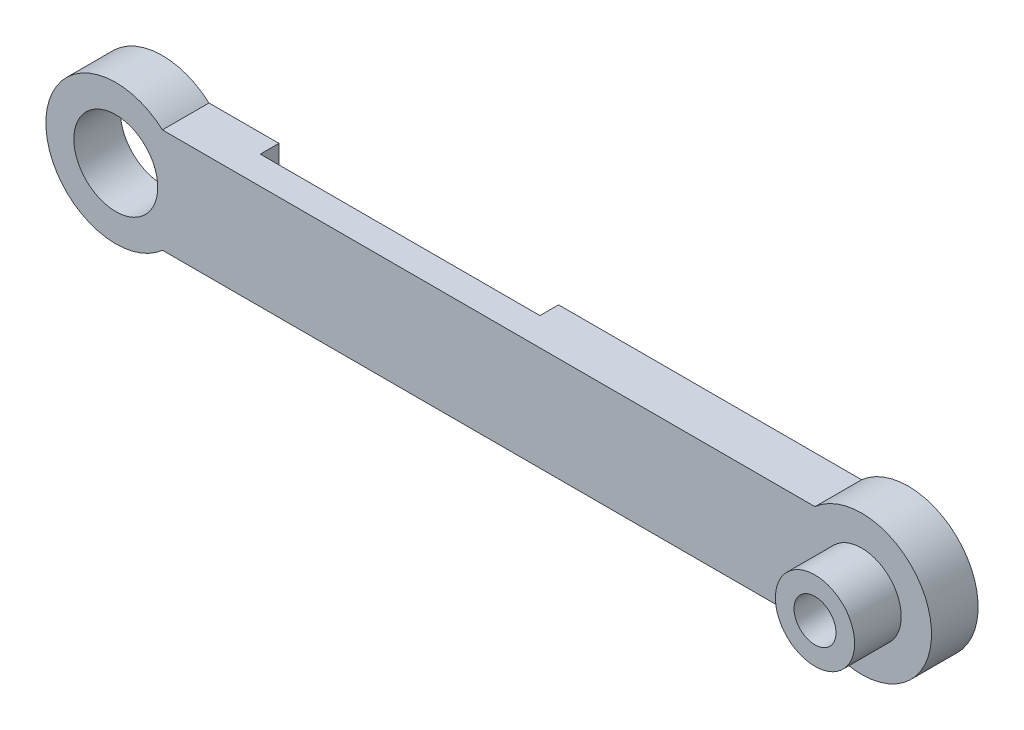
ISO-10303-21;
HEADER;
FILE_DESCRIPTION(('STEP AP214'),'2;1');
FILE_NAME('part.step','',(''),(''),'','','');
FILE_SCHEMA(('AUTOMOTIVE_DESIGN { 1 0 10303 214 1 1 1 1 }'));
ENDSEC;
DATA;
#1=APPLICATION_CONTEXT('core data for automotive mechanical design processes');
#2=APPLICATION_PROTOCOL_DEFINITION('international standard','automotive_design',2000,#1);
#3=PRODUCT_CONTEXT('',#1,'mechanical');
#4=PRODUCT('Part','Part','',(#3));
#5=PRODUCT_RELATED_PRODUCT_CATEGORY('part','',(#4));
#6=PRODUCT_DEFINITION_FORMATION('','',#4);
#7=PRODUCT_DEFINITION_CONTEXT('part definition',#1,'design');
#8=PRODUCT_DEFINITION('design','',#6,#7);
#9=PRODUCT_DEFINITION_SHAPE('','',#8);
#10=(LENGTH_UNIT() NAMED_UNIT(*) SI_UNIT(.MILLI.,.METRE.));
#11=(NAMED_UNIT(*) PLANE_ANGLE_UNIT() SI_UNIT($,.RADIAN.));
#12=(NAMED_UNIT(*) SI_UNIT($,.STERADIAN.) SOLID_ANGLE_UNIT());
#13=UNCERTAINTY_MEASURE_WITH_UNIT(LENGTH_MEASURE(1.E-05),#10,'distance_accuracy_value','');
#14=(GEOMETRIC_REPRESENTATION_CONTEXT(3) GLOBAL_UNCERTAINTY_ASSIGNED_CONTEXT((#13)) GLOBAL_UNIT_ASSIGNED_CONTEXT((#10,
#11,#12)) REPRESENTATION_CONTEXT('',''));
#15=CARTESIAN_POINT('',(0.,0.,0.));
#16=DIRECTION('',(0.,0.,1.));
#17=DIRECTION('',(1.,0.,0.));
#18=AXIS2_PLACEMENT_3D('',#15,#16,#17);
#19=CARTESIAN_POINT('',(0.,0.,0.));
#20=DIRECTION('',(0.,0.,1.));
#21=DIRECTION('',(1.,0.,0.));
#22=AXIS2_PLACEMENT_3D('',#19,#20,#21);
#23=PLANE('',#22);
#24=CARTESIAN_POINT('',(0.,0.,0.));
#25=DIRECTION('',(0.,0.,1.));
#26=DIRECTION('',(1.,0.,0.));
#27=AXIS2_PLACEMENT_3D('',#24,#25,#26);
#28=CIRCLE('',#27,4.5);
#29=CARTESIAN_POINT('',(4.5,0.,0.));
#30=VERTEX_POINT('',#29);
#31=EDGE_CURVE('E148',#30,#30,#28,.T.);
#32=ORIENTED_EDGE('',*,*,#31,.T.);
#33=EDGE_LOOP('',(#32));
#34=FACE_BOUND('',#33,.T.);
#35=DIRECTION('',(-1.,0.,0.));
#36=VECTOR('',#35,1.);
#37=CARTESIAN_POINT('',(4.99999999999999,5.59016994374956,0.));
#38=LINE('',#37,#36);
#39=CARTESIAN_POINT('',(12.4999999999999,5.59016994374956,0.));
#40=VERTEX_POINT('',#39);
#41=CARTESIAN_POINT('',(4.99999999999999,5.59016994374956,0.));
#42=VERTEX_POINT('',#41);
#43=EDGE_CURVE('E77',#40,#42,#38,.T.);
#44=ORIENTED_EDGE('',*,*,#43,.F.);
#45=DIRECTION('',(0.,1.,0.));
#46=VECTOR('',#45,1.);
#47=CARTESIAN_POINT('',(12.4999999999999,-7.50100000000007,0.));
#48=LINE('',#47,#46);
#49=CARTESIAN_POINT('',(12.4999999999999,-5.59016994374956,0.));
#50=VERTEX_POINT('',#49);
#51=EDGE_CURVE('E121',#50,#40,#48,.T.);
#52=ORIENTED_EDGE('',*,*,#51,.F.);
#53=DIRECTION('',(1.,0.,0.));
#54=VECTOR('',#53,1.);
#55=CARTESIAN_POINT('',(4.99999999999999,-5.59016994374956,0.));
#56=LINE('',#55,#54);
#57=CARTESIAN_POINT('',(4.99999999999999,-5.59016994374956,0.));
#58=VERTEX_POINT('',#57);
#59=EDGE_CURVE('E125',#58,#50,#56,.T.);
#60=ORIENTED_EDGE('',*,*,#59,.F.);
#61=CARTESIAN_POINT('',(0.,0.,0.));
#62=DIRECTION('',(0.,0.,1.));
#63=DIRECTION('',(1.,0.,0.));
#64=AXIS2_PLACEMENT_3D('',#61,#62,#63);
#65=CIRCLE('',#64,7.50000000000006);
#66=EDGE_CURVE('E154',#42,#58,#65,.T.);
#67=ORIENTED_EDGE('',*,*,#66,.F.);
#68=EDGE_LOOP('',(#44,#52,#60,#67));
#69=FACE_BOUND('',#68,.T.);
#70=ADVANCED_FACE('F33',(#34,#69),#23,.F.);
#71=CARTESIAN_POINT('',(0.,0.,5.));
#72=DIRECTION('',(0.,0.,1.));
#73=DIRECTION('',(1.,0.,0.));
#74=AXIS2_PLACEMENT_3D('',#71,#72,#73);
#75=PLANE('',#74);
#76=CARTESIAN_POINT('',(80.,0.,5.));
#77=DIRECTION('',(0.,0.,1.));
#78=DIRECTION('',(1.,0.,0.));
#79=AXIS2_PLACEMENT_3D('',#76,#77,#78);
#80=CIRCLE('',#79,4.25000000000001);
#81=CARTESIAN_POINT('',(84.25,0.,5.));
#82=VERTEX_POINT('',#81);
#83=EDGE_CURVE('E144',#82,#82,#80,.T.);
#84=ORIENTED_EDGE('',*,*,#83,.F.);
#85=EDGE_LOOP('',(#84));
#86=FACE_BOUND('',#85,.T.);
#87=CARTESIAN_POINT('',(0.,0.,5.));
#88=DIRECTION('',(0.,0.,1.));
#89=DIRECTION('',(1.,0.,0.));
#90=AXIS2_PLACEMENT_3D('',#87,#88,#89);
#91=CIRCLE('',#90,7.50000000000006);
#92=CARTESIAN_POINT('',(4.99999999999999,5.59016994374956,5.));
#93=VERTEX_POINT('',#92);
#94=CARTESIAN_POINT('',(4.99999999999999,-5.59016994374956,5.));
#95=VERTEX_POINT('',#94);
#96=EDGE_CURVE('E157',#93,#95,#91,.T.);
#97=ORIENTED_EDGE('',*,*,#96,.T.);
#98=DIRECTION('',(1.,0.,0.));
#99=VECTOR('',#98,1.);
#100=CARTESIAN_POINT('',(4.99999999999999,-5.59016994374956,5.));
#101=LINE('',#100,#99);
#102=CARTESIAN_POINT('',(75.,-5.59016994374956,5.));
#103=VERTEX_POINT('',#102);
#104=EDGE_CURVE('E84',#95,#103,#101,.T.);
#105=ORIENTED_EDGE('',*,*,#104,.T.);
#106=CARTESIAN_POINT('',(80.,0.,5.));
#107=DIRECTION('',(0.,0.,1.));
#108=DIRECTION('',(1.,0.,0.));
#109=AXIS2_PLACEMENT_3D('',#106,#107,#108);
#110=CIRCLE('',#109,7.50000000000007);
#111=CARTESIAN_POINT('',(75.,5.59016994374956,5.));
#112=VERTEX_POINT('',#111);
#113=EDGE_CURVE('E161',#103,#112,#110,.T.);
#114=ORIENTED_EDGE('',*,*,#113,.T.);
#115=DIRECTION('',(-1.,0.,0.));
#116=VECTOR('',#115,1.);
#117=CARTESIAN_POINT('',(4.99999999999999,5.59016994374956,5.));
#118=LINE('',#117,#116);
#119=EDGE_CURVE('E57',#112,#93,#118,.T.);
#120=ORIENTED_EDGE('',*,*,#119,.T.);
#121=EDGE_LOOP('',(#97,#105,#114,#120));
#122=FACE_BOUND('',#121,.T.);
#123=CARTESIAN_POINT('',(0.,0.,5.));
#124=DIRECTION('',(0.,0.,1.));
#125=DIRECTION('',(1.,0.,0.));
#126=AXIS2_PLACEMENT_3D('',#123,#124,#125);
#127=CIRCLE('',#126,4.5);
#128=CARTESIAN_POINT('',(4.5,0.,5.));
#129=VERTEX_POINT('',#128);
#130=EDGE_CURVE('E151',#129,#129,#127,.T.);
#131=ORIENTED_EDGE('',*,*,#130,.F.);
#132=EDGE_LOOP('',(#131));
#133=FACE_BOUND('',#132,.T.);
#134=ADVANCED_FACE('F192',(#86,#122,#133),#75,.T.);
#135=CARTESIAN_POINT('',(80.,0.,0.));
#136=DIRECTION('',(0.,0.,1.));
#137=DIRECTION('',(1.,0.,0.));
#138=AXIS2_PLACEMENT_3D('',#135,#136,#137);
#139=CIRCLE('',#138,2.25);
#140=CARTESIAN_POINT('',(82.25,0.,0.));
#141=VERTEX_POINT('',#140);
#142=EDGE_CURVE('E141',#141,#141,#139,.T.);
#143=ORIENTED_EDGE('',*,*,#142,.T.);
#144=EDGE_LOOP('',(#143));
#145=FACE_BOUND('',#144,.T.);
#146=CARTESIAN_POINT('',(42.4999999999999,-5.59016994374956,0.));
#147=VERTEX_POINT('',#146);
#148=CARTESIAN_POINT('',(75.,-5.59016994374956,0.));
#149=VERTEX_POINT('',#148);
#150=EDGE_CURVE('E167',#147,#149,#56,.T.);
#151=ORIENTED_EDGE('',*,*,#150,.F.);
#152=DIRECTION('',(0.,1.,0.));
#153=VECTOR('',#152,1.);
#154=CARTESIAN_POINT('',(42.4999999999999,-7.50100000000007,0.));
#155=LINE('',#154,#153);
#156=CARTESIAN_POINT('',(42.4999999999999,5.59016994374956,0.));
#157=VERTEX_POINT('',#156);
#158=EDGE_CURVE('E135',#147,#157,#155,.T.);
#159=ORIENTED_EDGE('',*,*,#158,.T.);
#160=CARTESIAN_POINT('',(75.,5.59016994374956,0.));
#161=VERTEX_POINT('',#160);
#162=EDGE_CURVE('E159',#161,#157,#38,.T.);
#163=ORIENTED_EDGE('',*,*,#162,.F.);
#164=CARTESIAN_POINT('',(80.,0.,0.));
#165=DIRECTION('',(0.,0.,1.));
#166=DIRECTION('',(1.,0.,0.));
#167=AXIS2_PLACEMENT_3D('',#164,#165,#166);
#168=CIRCLE('',#167,7.50000000000007);
#169=EDGE_CURVE('E169',#149,#161,#168,.T.);
#170=ORIENTED_EDGE('',*,*,#169,.F.);
#171=EDGE_LOOP('',(#151,#159,#163,#170));
#172=FACE_BOUND('',#171,.T.);
#173=ADVANCED_FACE('F185',(#145,#172),#23,.F.);
#174=CARTESIAN_POINT('',(0.,0.,5.));
#175=DIRECTION('',(0.,0.,-1.));
#176=DIRECTION('',(-1.,0.,0.));
#177=AXIS2_PLACEMENT_3D('',#174,#175,#176);
#178=CYLINDRICAL_SURFACE('',#177,7.50000000000006);
#179=ORIENTED_EDGE('',*,*,#66,.T.);
#180=DIRECTION('',(0.,0.,-1.));
#181=VECTOR('',#180,1.);
#182=CARTESIAN_POINT('',(4.99999999999999,-5.59016994374956,5.));
#183=LINE('',#182,#181);
#184=EDGE_CURVE('E11',#95,#58,#183,.T.);
#185=ORIENTED_EDGE('',*,*,#184,.F.);
#186=ORIENTED_EDGE('',*,*,#96,.F.);
#187=DIRECTION('',(0.,0.,-1.));
#188=VECTOR('',#187,1.);
#189=CARTESIAN_POINT('',(4.99999999999999,5.59016994374956,5.));
#190=LINE('',#189,#188);
#191=EDGE_CURVE('E164',#93,#42,#190,.T.);
#192=ORIENTED_EDGE('',*,*,#191,.T.);
#193=EDGE_LOOP('',(#179,#185,#186,#192));
#194=FACE_BOUND('',#193,.T.);
#195=ADVANCED_FACE('F35',(#194),#178,.T.);
#196=CARTESIAN_POINT('',(4.99999999999999,-5.59016994374956,5.));
#197=DIRECTION('',(0.,1.,0.));
#198=DIRECTION('',(0.,0.,1.));
#199=AXIS2_PLACEMENT_3D('',#196,#197,#198);
#200=PLANE('',#199);
#201=ORIENTED_EDGE('',*,*,#59,.T.);
#202=DIRECTION('',(0.,0.,-1.));
#203=VECTOR('',#202,1.);
#204=CARTESIAN_POINT('',(12.4999999999999,-5.59016994374956,0.));
#205=LINE('',#204,#203);
#206=CARTESIAN_POINT('',(12.4999999999999,-5.59016994374956,2.));
#207=VERTEX_POINT('',#206);
#208=EDGE_CURVE('E107',#207,#50,#205,.T.);
#209=ORIENTED_EDGE('',*,*,#208,.F.);
#210=DIRECTION('',(-1.,0.,0.));
#211=VECTOR('',#210,1.);
#212=CARTESIAN_POINT('',(12.4999999999999,-5.59016994374956,2.));
#213=LINE('',#212,#211);
#214=CARTESIAN_POINT('',(42.4999999999999,-5.59016994374956,2.));
#215=VERTEX_POINT('',#214);
#216=EDGE_CURVE('E116',#215,#207,#213,.T.);
#217=ORIENTED_EDGE('',*,*,#216,.F.);
#218=DIRECTION('',(0.,0.,1.));
#219=VECTOR('',#218,1.);
#220=CARTESIAN_POINT('',(42.4999999999999,-5.59016994374956,0.));
#221=LINE('',#220,#219);
#222=EDGE_CURVE('E126',#147,#215,#221,.T.);
#223=ORIENTED_EDGE('',*,*,#222,.F.);
#224=ORIENTED_EDGE('',*,*,#150,.T.);
#225=DIRECTION('',(0.,0.,-1.));
#226=VECTOR('',#225,1.);
#227=CARTESIAN_POINT('',(75.,-5.59016994374956,5.));
#228=LINE('',#227,#226);
#229=EDGE_CURVE('E41',#103,#149,#228,.T.);
#230=ORIENTED_EDGE('',*,*,#229,.F.);
#231=ORIENTED_EDGE('',*,*,#104,.F.);
#232=ORIENTED_EDGE('',*,*,#184,.T.);
#233=EDGE_LOOP('',(#201,#209,#217,#223,#224,#230,#231,#232));
#234=FACE_BOUND('',#233,.T.);
#235=ADVANCED_FACE('F124',(#234),#200,.F.);
#236=CARTESIAN_POINT('',(80.,0.,5.));
#237=DIRECTION('',(0.,0.,-1.));
#238=DIRECTION('',(-1.,0.,0.));
#239=AXIS2_PLACEMENT_3D('',#236,#237,#238);
#240=CYLINDRICAL_SURFACE('',#239,7.50000000000007);
#241=ORIENTED_EDGE('',*,*,#169,.T.);
#242=DIRECTION('',(0.,0.,-1.));
#243=VECTOR('',#242,1.);
#244=CARTESIAN_POINT('',(75.,5.59016994374956,5.));
#245=LINE('',#244,#243);
#246=EDGE_CURVE('E174',#112,#161,#245,.T.);
#247=ORIENTED_EDGE('',*,*,#246,.F.);
#248=ORIENTED_EDGE('',*,*,#113,.F.);
#249=ORIENTED_EDGE('',*,*,#229,.T.);
#250=EDGE_LOOP('',(#241,#247,#248,#249));
#251=FACE_BOUND('',#250,.T.);
#252=ADVANCED_FACE('F180',(#251),#240,.T.);
#253=CARTESIAN_POINT('',(4.99999999999999,5.59016994374956,5.));
#254=DIRECTION('',(0.,-1.,0.));
#255=DIRECTION('',(0.,0.,-1.));
#256=AXIS2_PLACEMENT_3D('',#253,#254,#255);
#257=PLANE('',#256);
#258=DIRECTION('',(1.,0.,0.));
#259=VECTOR('',#258,1.);
#260=CARTESIAN_POINT('',(12.4999999999999,5.59016994374956,2.));
#261=LINE('',#260,#259);
#262=CARTESIAN_POINT('',(12.4999999999999,5.59016994374956,2.));
#263=VERTEX_POINT('',#262);
#264=CARTESIAN_POINT('',(42.4999999999999,5.59016994374956,2.));
#265=VERTEX_POINT('',#264);
#266=EDGE_CURVE('E128',#263,#265,#261,.T.);
#267=ORIENTED_EDGE('',*,*,#266,.F.);
#268=DIRECTION('',(0.,0.,1.));
#269=VECTOR('',#268,1.);
#270=CARTESIAN_POINT('',(12.4999999999999,5.59016994374956,0.));
#271=LINE('',#270,#269);
#272=EDGE_CURVE('E48',#40,#263,#271,.T.);
#273=ORIENTED_EDGE('',*,*,#272,.F.);
#274=ORIENTED_EDGE('',*,*,#43,.T.);
#275=ORIENTED_EDGE('',*,*,#191,.F.);
#276=ORIENTED_EDGE('',*,*,#119,.F.);
#277=ORIENTED_EDGE('',*,*,#246,.T.);
#278=ORIENTED_EDGE('',*,*,#162,.T.);
#279=DIRECTION('',(0.,0.,-1.));
#280=VECTOR('',#279,1.);
#281=CARTESIAN_POINT('',(42.4999999999999,5.59016994374956,0.));
#282=LINE('',#281,#280);
#283=EDGE_CURVE('E113',#265,#157,#282,.T.);
#284=ORIENTED_EDGE('',*,*,#283,.F.);
#285=EDGE_LOOP('',(#267,#273,#274,#275,#276,#277,#278,#284));
#286=FACE_BOUND('',#285,.T.);
#287=ADVANCED_FACE('F187',(#286),#257,.F.);
#288=CARTESIAN_POINT('',(0.,0.,5.));
#289=DIRECTION('',(0.,0.,-1.));
#290=DIRECTION('',(-1.,0.,0.));
#291=AXIS2_PLACEMENT_3D('',#288,#289,#290);
#292=CYLINDRICAL_SURFACE('',#291,4.5);
#293=ORIENTED_EDGE('',*,*,#130,.T.);
#294=EDGE_LOOP('',(#293));
#295=FACE_BOUND('',#294,.T.);
#296=ORIENTED_EDGE('',*,*,#31,.F.);
#297=EDGE_LOOP('',(#296));
#298=FACE_BOUND('',#297,.T.);
#299=ADVANCED_FACE('F199',(#295,#298),#292,.F.);
#300=CARTESIAN_POINT('',(80.,0.,10.));
#301=DIRECTION('',(0.,0.,-1.));
#302=DIRECTION('',(-1.,0.,0.));
#303=AXIS2_PLACEMENT_3D('',#300,#301,#302);
#304=CYLINDRICAL_SURFACE('',#303,4.25000000000001);
#305=CARTESIAN_POINT('',(80.,0.,10.));
#306=DIRECTION('',(0.,0.,1.));
#307=DIRECTION('',(1.,0.,0.));
#308=AXIS2_PLACEMENT_3D('',#305,#306,#307);
#309=CIRCLE('',#308,4.25000000000001);
#310=CARTESIAN_POINT('',(84.25,0.,10.));
#311=VERTEX_POINT('',#310);
#312=EDGE_CURVE('E145',#311,#311,#309,.T.);
#313=ORIENTED_EDGE('',*,*,#312,.F.);
#314=EDGE_LOOP('',(#313));
#315=FACE_BOUND('',#314,.T.);
#316=ORIENTED_EDGE('',*,*,#83,.T.);
#317=EDGE_LOOP('',(#316));
#318=FACE_BOUND('',#317,.T.);
#319=ADVANCED_FACE('F202',(#315,#318),#304,.T.);
#320=CARTESIAN_POINT('',(80.,0.,10.));
#321=DIRECTION('',(0.,0.,1.));
#322=DIRECTION('',(1.,0.,0.));
#323=AXIS2_PLACEMENT_3D('',#320,#321,#322);
#324=PLANE('',#323);
#325=CARTESIAN_POINT('',(80.,0.,10.));
#326=DIRECTION('',(0.,0.,1.));
#327=DIRECTION('',(1.,0.,0.));
#328=AXIS2_PLACEMENT_3D('',#325,#326,#327);
#329=CIRCLE('',#328,2.25);
#330=CARTESIAN_POINT('',(82.25,0.,10.));
#331=VERTEX_POINT('',#330);
#332=EDGE_CURVE('E120',#331,#331,#329,.T.);
#333=ORIENTED_EDGE('',*,*,#332,.F.);
#334=EDGE_LOOP('',(#333));
#335=FACE_BOUND('',#334,.T.);
#336=ORIENTED_EDGE('',*,*,#312,.T.);
#337=EDGE_LOOP('',(#336));
#338=FACE_BOUND('',#337,.T.);
#339=ADVANCED_FACE('F223',(#335,#338),#324,.T.);
#340=CARTESIAN_POINT('',(80.,0.,-8.));
#341=DIRECTION('',(0.,0.,1.));
#342=DIRECTION('',(1.,0.,0.));
#343=AXIS2_PLACEMENT_3D('',#340,#341,#342);
#344=CYLINDRICAL_SURFACE('',#343,2.25);
#345=ORIENTED_EDGE('',*,*,#332,.T.);
#346=EDGE_LOOP('',(#345));
#347=FACE_BOUND('',#346,.T.);
#348=ORIENTED_EDGE('',*,*,#142,.F.);
#349=EDGE_LOOP('',(#348));
#350=FACE_BOUND('',#349,.T.);
#351=ADVANCED_FACE('F221',(#347,#350),#344,.F.);
#352=CARTESIAN_POINT('',(12.4999999999999,-7.50100000000007,0.));
#353=DIRECTION('',(-1.,0.,0.));
#354=DIRECTION('',(0.,0.,1.));
#355=AXIS2_PLACEMENT_3D('',#352,#353,#354);
#356=PLANE('',#355);
#357=ORIENTED_EDGE('',*,*,#208,.T.);
#358=ORIENTED_EDGE('',*,*,#51,.T.);
#359=ORIENTED_EDGE('',*,*,#272,.T.);
#360=DIRECTION('',(0.,1.,0.));
#361=VECTOR('',#360,1.);
#362=CARTESIAN_POINT('',(12.4999999999999,-7.50100000000007,2.));
#363=LINE('',#362,#361);
#364=EDGE_CURVE('E103',#207,#263,#363,.T.);
#365=ORIENTED_EDGE('',*,*,#364,.F.);
#366=EDGE_LOOP('',(#357,#358,#359,#365));
#367=FACE_BOUND('',#366,.T.);
#368=ADVANCED_FACE('F105',(#367),#356,.F.);
#369=CARTESIAN_POINT('',(42.4999999999999,-7.50100000000007,0.));
#370=DIRECTION('',(1.,0.,0.));
#371=DIRECTION('',(0.,0.,-1.));
#372=AXIS2_PLACEMENT_3D('',#369,#370,#371);
#373=PLANE('',#372);
#374=ORIENTED_EDGE('',*,*,#222,.T.);
#375=DIRECTION('',(0.,1.,0.));
#376=VECTOR('',#375,1.);
#377=CARTESIAN_POINT('',(42.4999999999999,-7.50100000000007,2.));
#378=LINE('',#377,#376);
#379=EDGE_CURVE('E112',#215,#265,#378,.T.);
#380=ORIENTED_EDGE('',*,*,#379,.T.);
#381=ORIENTED_EDGE('',*,*,#283,.T.);
#382=ORIENTED_EDGE('',*,*,#158,.F.);
#383=EDGE_LOOP('',(#374,#380,#381,#382));
#384=FACE_BOUND('',#383,.T.);
#385=ADVANCED_FACE('F230',(#384),#373,.F.);
#386=CARTESIAN_POINT('',(12.4999999999999,-7.50100000000007,2.));
#387=DIRECTION('',(0.,0.,1.));
#388=DIRECTION('',(1.,0.,0.));
#389=AXIS2_PLACEMENT_3D('',#386,#387,#388);
#390=PLANE('',#389);
#391=ORIENTED_EDGE('',*,*,#216,.T.);
#392=ORIENTED_EDGE('',*,*,#364,.T.);
#393=ORIENTED_EDGE('',*,*,#266,.T.);
#394=ORIENTED_EDGE('',*,*,#379,.F.);
#395=EDGE_LOOP('',(#391,#392,#393,#394));
#396=FACE_BOUND('',#395,.T.);
#397=ADVANCED_FACE('F117',(#396),#390,.F.);
#398=CLOSED_SHELL('',(#70,#134,#173,#195,#235,#252,#287,#299,#319,#339,#351,#368,#385,#397));
#399=MANIFOLD_SOLID_BREP('B2',#398);
#400=ADVANCED_BREP_SHAPE_REPRESENTATION('',(#18,#399),#14);
#401=SHAPE_DEFINITION_REPRESENTATION(#9,#400);
ENDSEC;
END-ISO-10303-21;
